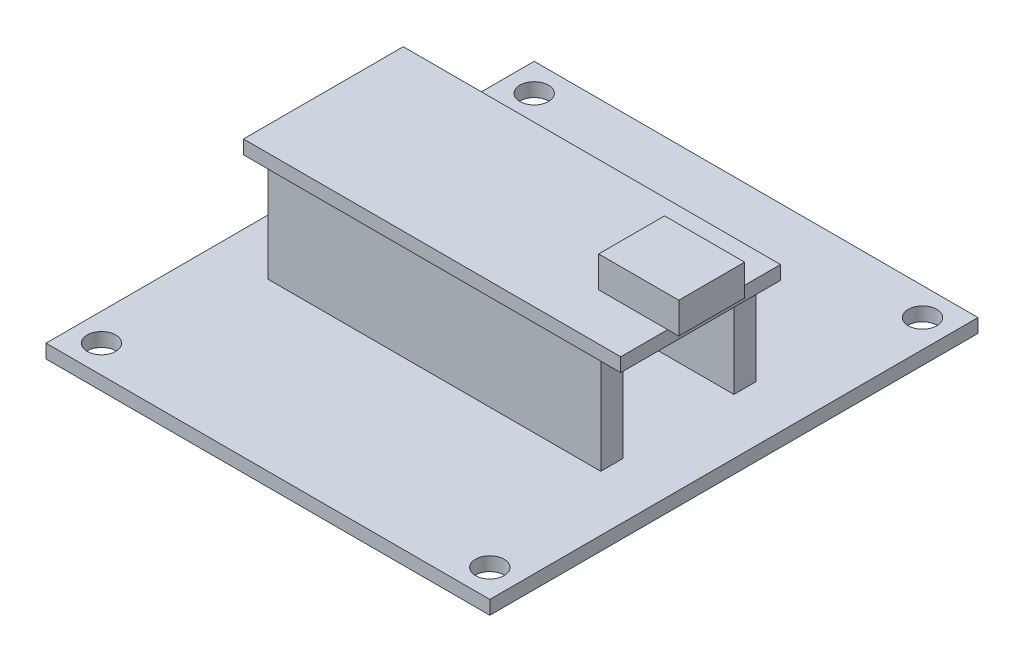
ISO-10303-21;
HEADER;
FILE_DESCRIPTION(('STEP AP214'),'2;1');
FILE_NAME('part.step','',(''),(''),'','','');
FILE_SCHEMA(('AUTOMOTIVE_DESIGN { 1 0 10303 214 1 1 1 1 }'));
ENDSEC;
DATA;
#1=APPLICATION_CONTEXT('core data for automotive mechanical design processes');
#2=APPLICATION_PROTOCOL_DEFINITION('international standard','automotive_design',2000,#1);
#3=PRODUCT_CONTEXT('',#1,'mechanical');
#4=PRODUCT('Part','Part','',(#3));
#5=PRODUCT_RELATED_PRODUCT_CATEGORY('part','',(#4));
#6=PRODUCT_DEFINITION_FORMATION('','',#4);
#7=PRODUCT_DEFINITION_CONTEXT('part definition',#1,'design');
#8=PRODUCT_DEFINITION('design','',#6,#7);
#9=PRODUCT_DEFINITION_SHAPE('','',#8);
#10=(LENGTH_UNIT() NAMED_UNIT(*) SI_UNIT(.MILLI.,.METRE.));
#11=(NAMED_UNIT(*) PLANE_ANGLE_UNIT() SI_UNIT($,.RADIAN.));
#12=(NAMED_UNIT(*) SI_UNIT($,.STERADIAN.) SOLID_ANGLE_UNIT());
#13=UNCERTAINTY_MEASURE_WITH_UNIT(LENGTH_MEASURE(1.E-05),#10,'distance_accuracy_value','');
#14=(GEOMETRIC_REPRESENTATION_CONTEXT(3) GLOBAL_UNCERTAINTY_ASSIGNED_CONTEXT((#13)) GLOBAL_UNIT_ASSIGNED_CONTEXT((#10,
#11,#12)) REPRESENTATION_CONTEXT('',''));
#15=CARTESIAN_POINT('',(0.,0.,0.));
#16=DIRECTION('',(0.,0.,1.));
#17=DIRECTION('',(1.,0.,0.));
#18=AXIS2_PLACEMENT_3D('',#15,#16,#17);
#19=CARTESIAN_POINT('',(21.59,14.3256,-9.144));
#20=DIRECTION('',(0.,-1.,0.));
#21=DIRECTION('',(0.,0.,-1.));
#22=AXIS2_PLACEMENT_3D('',#19,#20,#21);
#23=PLANE('',#22);
#24=DIRECTION('',(1.,0.,0.));
#25=VECTOR('',#24,1.);
#26=CARTESIAN_POINT('',(13.6906,14.3256,3.7719));
#27=LINE('',#26,#25);
#28=CARTESIAN_POINT('',(13.6906,14.3256,3.7719));
#29=VERTEX_POINT('',#28);
#30=CARTESIAN_POINT('',(21.59,14.3256,3.7719));
#31=VERTEX_POINT('',#30);
#32=EDGE_CURVE('E51',#29,#31,#27,.T.);
#33=ORIENTED_EDGE('',*,*,#32,.F.);
#34=DIRECTION('',(0.,0.,1.));
#35=VECTOR('',#34,1.);
#36=CARTESIAN_POINT('',(13.6906,14.3256,3.7719));
#37=LINE('',#36,#35);
#38=CARTESIAN_POINT('',(13.6906,14.3256,-3.7719));
#39=VERTEX_POINT('',#38);
#40=EDGE_CURVE('E693',#39,#29,#37,.T.);
#41=ORIENTED_EDGE('',*,*,#40,.F.);
#42=DIRECTION('',(-1.,0.,0.));
#43=VECTOR('',#42,1.);
#44=CARTESIAN_POINT('',(13.6906,14.3256,-3.7719));
#45=LINE('',#44,#43);
#46=CARTESIAN_POINT('',(21.59,14.3256,-3.7719));
#47=VERTEX_POINT('',#46);
#48=EDGE_CURVE('E11',#47,#39,#45,.T.);
#49=ORIENTED_EDGE('',*,*,#48,.F.);
#50=DIRECTION('',(0.,0.,-1.));
#51=VECTOR('',#50,1.);
#52=CARTESIAN_POINT('',(21.59,14.3256,9.144));
#53=LINE('',#52,#51);
#54=CARTESIAN_POINT('',(21.59,14.3256,-9.144));
#55=VERTEX_POINT('',#54);
#56=EDGE_CURVE('E215',#47,#55,#53,.T.);
#57=ORIENTED_EDGE('',*,*,#56,.T.);
#58=DIRECTION('',(-1.,0.,0.));
#59=VECTOR('',#58,1.);
#60=CARTESIAN_POINT('',(-21.59,14.3256,-9.144));
#61=LINE('',#60,#59);
#62=CARTESIAN_POINT('',(-21.59,14.3256,-9.144));
#63=VERTEX_POINT('',#62);
#64=EDGE_CURVE('E213',#55,#63,#61,.T.);
#65=ORIENTED_EDGE('',*,*,#64,.T.);
#66=DIRECTION('',(0.,0.,1.));
#67=VECTOR('',#66,1.);
#68=CARTESIAN_POINT('',(-21.59,14.3256,9.144));
#69=LINE('',#68,#67);
#70=CARTESIAN_POINT('',(-21.59,14.3256,9.144));
#71=VERTEX_POINT('',#70);
#72=EDGE_CURVE('E217',#63,#71,#69,.T.);
#73=ORIENTED_EDGE('',*,*,#72,.T.);
#74=DIRECTION('',(1.,0.,0.));
#75=VECTOR('',#74,1.);
#76=CARTESIAN_POINT('',(-21.59,14.3256,9.144));
#77=LINE('',#76,#75);
#78=CARTESIAN_POINT('',(21.59,14.3256,9.144));
#79=VERTEX_POINT('',#78);
#80=EDGE_CURVE('E219',#71,#79,#77,.T.);
#81=ORIENTED_EDGE('',*,*,#80,.T.);
#82=EDGE_CURVE('E211',#79,#31,#53,.T.);
#83=ORIENTED_EDGE('',*,*,#82,.T.);
#84=EDGE_LOOP('',(#33,#41,#49,#57,#65,#73,#81,#83));
#85=FACE_BOUND('',#84,.T.);
#86=ADVANCED_FACE('F33',(#85),#23,.F.);
#87=CARTESIAN_POINT('',(25.4,1.5748,-27.94));
#88=DIRECTION('',(0.,-1.,0.));
#89=DIRECTION('',(0.,0.,-1.));
#90=AXIS2_PLACEMENT_3D('',#87,#88,#89);
#91=PLANE('',#90);
#92=DIRECTION('',(0.,0.,1.));
#93=VECTOR('',#92,1.);
#94=CARTESIAN_POINT('',(-19.05,1.5748,6.35));
#95=LINE('',#94,#93);
#96=CARTESIAN_POINT('',(-19.05,1.5748,6.35));
#97=VERTEX_POINT('',#96);
#98=CARTESIAN_POINT('',(-19.05,1.5748,8.89));
#99=VERTEX_POINT('',#98);
#100=EDGE_CURVE('E274',#97,#99,#95,.T.);
#101=ORIENTED_EDGE('',*,*,#100,.F.);
#102=DIRECTION('',(-1.,0.,0.));
#103=VECTOR('',#102,1.);
#104=CARTESIAN_POINT('',(-19.05,1.5748,6.35));
#105=LINE('',#104,#103);
#106=CARTESIAN_POINT('',(19.05,1.5748,6.35));
#107=VERTEX_POINT('',#106);
#108=EDGE_CURVE('E279',#107,#97,#105,.T.);
#109=ORIENTED_EDGE('',*,*,#108,.F.);
#110=DIRECTION('',(0.,0.,-1.));
#111=VECTOR('',#110,1.);
#112=CARTESIAN_POINT('',(19.05,1.5748,6.35));
#113=LINE('',#112,#111);
#114=CARTESIAN_POINT('',(19.05,1.5748,8.89));
#115=VERTEX_POINT('',#114);
#116=EDGE_CURVE('E294',#115,#107,#113,.T.);
#117=ORIENTED_EDGE('',*,*,#116,.F.);
#118=DIRECTION('',(1.,0.,0.));
#119=VECTOR('',#118,1.);
#120=CARTESIAN_POINT('',(-19.05,1.5748,8.89));
#121=LINE('',#120,#119);
#122=EDGE_CURVE('E291',#99,#115,#121,.T.);
#123=ORIENTED_EDGE('',*,*,#122,.F.);
#124=EDGE_LOOP('',(#101,#109,#117,#123));
#125=FACE_BOUND('',#124,.T.);
#126=CARTESIAN_POINT('',(-22.225,1.5748,24.765));
#127=DIRECTION('',(0.,1.,0.));
#128=DIRECTION('',(0.,0.,1.));
#129=AXIS2_PLACEMENT_3D('',#126,#127,#128);
#130=CIRCLE('',#129,1.63194999999999);
#131=CARTESIAN_POINT('',(-22.225,1.5748,26.39695));
#132=VERTEX_POINT('',#131);
#133=EDGE_CURVE('E310',#132,#132,#130,.T.);
#134=ORIENTED_EDGE('',*,*,#133,.F.);
#135=EDGE_LOOP('',(#134));
#136=FACE_BOUND('',#135,.T.);
#137=CARTESIAN_POINT('',(-22.225,1.5748,-24.765));
#138=DIRECTION('',(0.,1.,0.));
#139=DIRECTION('',(0.,0.,1.));
#140=AXIS2_PLACEMENT_3D('',#137,#138,#139);
#141=CIRCLE('',#140,1.63194999999999);
#142=CARTESIAN_POINT('',(-22.225,1.5748,-23.13305));
#143=VERTEX_POINT('',#142);
#144=EDGE_CURVE('E313',#143,#143,#141,.T.);
#145=ORIENTED_EDGE('',*,*,#144,.F.);
#146=EDGE_LOOP('',(#145));
#147=FACE_BOUND('',#146,.T.);
#148=CARTESIAN_POINT('',(22.225,1.5748,-24.765));
#149=DIRECTION('',(0.,1.,0.));
#150=DIRECTION('',(0.,0.,1.));
#151=AXIS2_PLACEMENT_3D('',#148,#149,#150);
#152=CIRCLE('',#151,1.63194999999999);
#153=CARTESIAN_POINT('',(22.225,1.5748,-23.13305));
#154=VERTEX_POINT('',#153);
#155=EDGE_CURVE('E317',#154,#154,#152,.T.);
#156=ORIENTED_EDGE('',*,*,#155,.F.);
#157=EDGE_LOOP('',(#156));
#158=FACE_BOUND('',#157,.T.);
#159=CARTESIAN_POINT('',(22.225,1.5748,24.765));
#160=DIRECTION('',(0.,1.,0.));
#161=DIRECTION('',(0.,0.,1.));
#162=AXIS2_PLACEMENT_3D('',#159,#160,#161);
#163=CIRCLE('',#162,1.63194999999999);
#164=CARTESIAN_POINT('',(22.225,1.5748,26.39695));
#165=VERTEX_POINT('',#164);
#166=EDGE_CURVE('E321',#165,#165,#163,.T.);
#167=ORIENTED_EDGE('',*,*,#166,.F.);
#168=EDGE_LOOP('',(#167));
#169=FACE_BOUND('',#168,.T.);
#170=DIRECTION('',(0.,0.,-1.));
#171=VECTOR('',#170,1.);
#172=CARTESIAN_POINT('',(25.4,1.5748,27.94));
#173=LINE('',#172,#171);
#174=CARTESIAN_POINT('',(25.4,1.5748,27.94));
#175=VERTEX_POINT('',#174);
#176=CARTESIAN_POINT('',(25.4,1.5748,-27.94));
#177=VERTEX_POINT('',#176);
#178=EDGE_CURVE('E328',#175,#177,#173,.T.);
#179=ORIENTED_EDGE('',*,*,#178,.T.);
#180=DIRECTION('',(-1.,0.,0.));
#181=VECTOR('',#180,1.);
#182=CARTESIAN_POINT('',(-25.4,1.5748,-27.94));
#183=LINE('',#182,#181);
#184=CARTESIAN_POINT('',(-25.4,1.5748,-27.94));
#185=VERTEX_POINT('',#184);
#186=EDGE_CURVE('E331',#177,#185,#183,.T.);
#187=ORIENTED_EDGE('',*,*,#186,.T.);
#188=DIRECTION('',(0.,0.,1.));
#189=VECTOR('',#188,1.);
#190=CARTESIAN_POINT('',(-25.4,1.5748,27.94));
#191=LINE('',#190,#189);
#192=CARTESIAN_POINT('',(-25.4,1.5748,27.94));
#193=VERTEX_POINT('',#192);
#194=EDGE_CURVE('E334',#185,#193,#191,.T.);
#195=ORIENTED_EDGE('',*,*,#194,.T.);
#196=DIRECTION('',(1.,0.,0.));
#197=VECTOR('',#196,1.);
#198=CARTESIAN_POINT('',(-25.4,1.5748,27.94));
#199=LINE('',#198,#197);
#200=EDGE_CURVE('E336',#193,#175,#199,.T.);
#201=ORIENTED_EDGE('',*,*,#200,.T.);
#202=EDGE_LOOP('',(#179,#187,#195,#201));
#203=FACE_BOUND('',#202,.T.);
#204=DIRECTION('',(0.,0.,1.));
#205=VECTOR('',#204,1.);
#206=CARTESIAN_POINT('',(-19.05,1.5748,-8.89));
#207=LINE('',#206,#205);
#208=CARTESIAN_POINT('',(-19.05,1.5748,-8.89));
#209=VERTEX_POINT('',#208);
#210=CARTESIAN_POINT('',(-19.05,1.5748,-6.35));
#211=VERTEX_POINT('',#210);
#212=EDGE_CURVE('E238',#209,#211,#207,.T.);
#213=ORIENTED_EDGE('',*,*,#212,.F.);
#214=DIRECTION('',(-1.,0.,0.));
#215=VECTOR('',#214,1.);
#216=CARTESIAN_POINT('',(-19.05,1.5748,-8.89));
#217=LINE('',#216,#215);
#218=CARTESIAN_POINT('',(19.05,1.5748,-8.89));
#219=VERTEX_POINT('',#218);
#220=EDGE_CURVE('E243',#219,#209,#217,.T.);
#221=ORIENTED_EDGE('',*,*,#220,.F.);
#222=DIRECTION('',(0.,0.,-1.));
#223=VECTOR('',#222,1.);
#224=CARTESIAN_POINT('',(19.05,1.5748,-8.89));
#225=LINE('',#224,#223);
#226=CARTESIAN_POINT('',(19.05,1.5748,-6.35));
#227=VERTEX_POINT('',#226);
#228=EDGE_CURVE('E258',#227,#219,#225,.T.);
#229=ORIENTED_EDGE('',*,*,#228,.F.);
#230=DIRECTION('',(1.,0.,0.));
#231=VECTOR('',#230,1.);
#232=CARTESIAN_POINT('',(-19.05,1.5748,-6.35));
#233=LINE('',#232,#231);
#234=EDGE_CURVE('E255',#211,#227,#233,.T.);
#235=ORIENTED_EDGE('',*,*,#234,.F.);
#236=EDGE_LOOP('',(#213,#221,#229,#235));
#237=FACE_BOUND('',#236,.T.);
#238=ADVANCED_FACE('F391',(#125,#136,#147,#158,#169,#203,#237),#91,.F.);
#239=CARTESIAN_POINT('',(25.4,1.5748,27.94));
#240=DIRECTION('',(-1.,0.,0.));
#241=DIRECTION('',(0.,0.,1.));
#242=AXIS2_PLACEMENT_3D('',#239,#240,#241);
#243=PLANE('',#242);
#244=DIRECTION('',(0.,0.,-1.));
#245=VECTOR('',#244,1.);
#246=CARTESIAN_POINT('',(25.4,0.,27.94));
#247=LINE('',#246,#245);
#248=CARTESIAN_POINT('',(25.4,0.,27.94));
#249=VERTEX_POINT('',#248);
#250=CARTESIAN_POINT('',(25.4,0.,-27.94));
#251=VERTEX_POINT('',#250);
#252=EDGE_CURVE('E327',#249,#251,#247,.T.);
#253=ORIENTED_EDGE('',*,*,#252,.T.);
#254=DIRECTION('',(0.,-1.,0.));
#255=VECTOR('',#254,1.);
#256=CARTESIAN_POINT('',(25.4,1.5748,-27.94));
#257=LINE('',#256,#255);
#258=EDGE_CURVE('E42',#177,#251,#257,.T.);
#259=ORIENTED_EDGE('',*,*,#258,.F.);
#260=ORIENTED_EDGE('',*,*,#178,.F.);
#261=DIRECTION('',(0.,-1.,0.));
#262=VECTOR('',#261,1.);
#263=CARTESIAN_POINT('',(25.4,1.5748,27.94));
#264=LINE('',#263,#262);
#265=EDGE_CURVE('E338',#175,#249,#264,.T.);
#266=ORIENTED_EDGE('',*,*,#265,.T.);
#267=EDGE_LOOP('',(#253,#259,#260,#266));
#268=FACE_BOUND('',#267,.T.);
#269=ADVANCED_FACE('F35',(#268),#243,.F.);
#270=CARTESIAN_POINT('',(-25.4,1.5748,-27.94));
#271=DIRECTION('',(0.,0.,1.));
#272=DIRECTION('',(1.,0.,0.));
#273=AXIS2_PLACEMENT_3D('',#270,#271,#272);
#274=PLANE('',#273);
#275=DIRECTION('',(-1.,0.,0.));
#276=VECTOR('',#275,1.);
#277=CARTESIAN_POINT('',(-25.4,0.,-27.94));
#278=LINE('',#277,#276);
#279=CARTESIAN_POINT('',(-25.4,0.,-27.94));
#280=VERTEX_POINT('',#279);
#281=EDGE_CURVE('E341',#251,#280,#278,.T.);
#282=ORIENTED_EDGE('',*,*,#281,.T.);
#283=DIRECTION('',(0.,-1.,0.));
#284=VECTOR('',#283,1.);
#285=CARTESIAN_POINT('',(-25.4,1.5748,-27.94));
#286=LINE('',#285,#284);
#287=EDGE_CURVE('E351',#185,#280,#286,.T.);
#288=ORIENTED_EDGE('',*,*,#287,.F.);
#289=ORIENTED_EDGE('',*,*,#186,.F.);
#290=ORIENTED_EDGE('',*,*,#258,.T.);
#291=EDGE_LOOP('',(#282,#288,#289,#290));
#292=FACE_BOUND('',#291,.T.);
#293=ADVANCED_FACE('F389',(#292),#274,.F.);
#294=CARTESIAN_POINT('',(-25.4,1.5748,27.94));
#295=DIRECTION('',(1.,0.,0.));
#296=DIRECTION('',(0.,0.,-1.));
#297=AXIS2_PLACEMENT_3D('',#294,#295,#296);
#298=PLANE('',#297);
#299=DIRECTION('',(0.,0.,1.));
#300=VECTOR('',#299,1.);
#301=CARTESIAN_POINT('',(-25.4,0.,27.94));
#302=LINE('',#301,#300);
#303=CARTESIAN_POINT('',(-25.4,0.,27.94));
#304=VERTEX_POINT('',#303);
#305=EDGE_CURVE('E343',#280,#304,#302,.T.);
#306=ORIENTED_EDGE('',*,*,#305,.T.);
#307=DIRECTION('',(0.,-1.,0.));
#308=VECTOR('',#307,1.);
#309=CARTESIAN_POINT('',(-25.4,1.5748,27.94));
#310=LINE('',#309,#308);
#311=EDGE_CURVE('E348',#193,#304,#310,.T.);
#312=ORIENTED_EDGE('',*,*,#311,.F.);
#313=ORIENTED_EDGE('',*,*,#194,.F.);
#314=ORIENTED_EDGE('',*,*,#287,.T.);
#315=EDGE_LOOP('',(#306,#312,#313,#314));
#316=FACE_BOUND('',#315,.T.);
#317=ADVANCED_FACE('F386',(#316),#298,.F.);
#318=CARTESIAN_POINT('',(-25.4,1.5748,27.94));
#319=DIRECTION('',(0.,0.,-1.));
#320=DIRECTION('',(-1.,0.,0.));
#321=AXIS2_PLACEMENT_3D('',#318,#319,#320);
#322=PLANE('',#321);
#323=DIRECTION('',(1.,0.,0.));
#324=VECTOR('',#323,1.);
#325=CARTESIAN_POINT('',(-25.4,0.,27.94));
#326=LINE('',#325,#324);
#327=EDGE_CURVE('E332',#304,#249,#326,.T.);
#328=ORIENTED_EDGE('',*,*,#327,.T.);
#329=ORIENTED_EDGE('',*,*,#265,.F.);
#330=ORIENTED_EDGE('',*,*,#200,.F.);
#331=ORIENTED_EDGE('',*,*,#311,.T.);
#332=EDGE_LOOP('',(#328,#329,#330,#331));
#333=FACE_BOUND('',#332,.T.);
#334=ADVANCED_FACE('F367',(#333),#322,.F.);
#335=CARTESIAN_POINT('',(25.4,0.,-27.94));
#336=DIRECTION('',(0.,-1.,0.));
#337=DIRECTION('',(0.,0.,-1.));
#338=AXIS2_PLACEMENT_3D('',#335,#336,#337);
#339=PLANE('',#338);
#340=CARTESIAN_POINT('',(-22.225,0.,24.765));
#341=DIRECTION('',(0.,-1.,0.));
#342=DIRECTION('',(0.,0.,-1.));
#343=AXIS2_PLACEMENT_3D('',#340,#341,#342);
#344=CIRCLE('',#343,1.63194999999999);
#345=CARTESIAN_POINT('',(-22.225,0.,23.13305));
#346=VERTEX_POINT('',#345);
#347=EDGE_CURVE('E37',#346,#346,#344,.T.);
#348=ORIENTED_EDGE('',*,*,#347,.F.);
#349=EDGE_LOOP('',(#348));
#350=FACE_BOUND('',#349,.T.);
#351=CARTESIAN_POINT('',(-22.225,0.,-24.765));
#352=DIRECTION('',(0.,-1.,0.));
#353=DIRECTION('',(0.,0.,-1.));
#354=AXIS2_PLACEMENT_3D('',#351,#352,#353);
#355=CIRCLE('',#354,1.63194999999999);
#356=CARTESIAN_POINT('',(-22.225,0.,-26.39695));
#357=VERTEX_POINT('',#356);
#358=EDGE_CURVE('E316',#357,#357,#355,.T.);
#359=ORIENTED_EDGE('',*,*,#358,.F.);
#360=EDGE_LOOP('',(#359));
#361=FACE_BOUND('',#360,.T.);
#362=CARTESIAN_POINT('',(22.225,0.,-24.765));
#363=DIRECTION('',(0.,-1.,0.));
#364=DIRECTION('',(0.,0.,-1.));
#365=AXIS2_PLACEMENT_3D('',#362,#363,#364);
#366=CIRCLE('',#365,1.63194999999999);
#367=CARTESIAN_POINT('',(22.225,0.,-26.39695));
#368=VERTEX_POINT('',#367);
#369=EDGE_CURVE('E320',#368,#368,#366,.T.);
#370=ORIENTED_EDGE('',*,*,#369,.F.);
#371=EDGE_LOOP('',(#370));
#372=FACE_BOUND('',#371,.T.);
#373=CARTESIAN_POINT('',(22.225,0.,24.765));
#374=DIRECTION('',(0.,-1.,0.));
#375=DIRECTION('',(0.,0.,-1.));
#376=AXIS2_PLACEMENT_3D('',#373,#374,#375);
#377=CIRCLE('',#376,1.63194999999999);
#378=CARTESIAN_POINT('',(22.225,0.,23.13305));
#379=VERTEX_POINT('',#378);
#380=EDGE_CURVE('E324',#379,#379,#377,.T.);
#381=ORIENTED_EDGE('',*,*,#380,.F.);
#382=EDGE_LOOP('',(#381));
#383=FACE_BOUND('',#382,.T.);
#384=ORIENTED_EDGE('',*,*,#252,.F.);
#385=ORIENTED_EDGE('',*,*,#327,.F.);
#386=ORIENTED_EDGE('',*,*,#305,.F.);
#387=ORIENTED_EDGE('',*,*,#281,.F.);
#388=EDGE_LOOP('',(#384,#385,#386,#387));
#389=FACE_BOUND('',#388,.T.);
#390=ADVANCED_FACE('F363',(#350,#361,#372,#383,#389),#339,.T.);
#391=CARTESIAN_POINT('',(22.225,1.5748,24.765));
#392=DIRECTION('',(0.,1.,0.));
#393=DIRECTION('',(0.,0.,1.));
#394=AXIS2_PLACEMENT_3D('',#391,#392,#393);
#395=CYLINDRICAL_SURFACE('',#394,1.63194999999999);
#396=ORIENTED_EDGE('',*,*,#380,.T.);
#397=EDGE_LOOP('',(#396));
#398=FACE_BOUND('',#397,.T.);
#399=ORIENTED_EDGE('',*,*,#166,.T.);
#400=EDGE_LOOP('',(#399));
#401=FACE_BOUND('',#400,.T.);
#402=ADVANCED_FACE('F366',(#398,#401),#395,.F.);
#403=CARTESIAN_POINT('',(22.225,1.5748,-24.765));
#404=DIRECTION('',(0.,1.,0.));
#405=DIRECTION('',(0.,0.,1.));
#406=AXIS2_PLACEMENT_3D('',#403,#404,#405);
#407=CYLINDRICAL_SURFACE('',#406,1.63194999999999);
#408=ORIENTED_EDGE('',*,*,#369,.T.);
#409=EDGE_LOOP('',(#408));
#410=FACE_BOUND('',#409,.T.);
#411=ORIENTED_EDGE('',*,*,#155,.T.);
#412=EDGE_LOOP('',(#411));
#413=FACE_BOUND('',#412,.T.);
#414=ADVANCED_FACE('F608',(#410,#413),#407,.F.);
#415=CARTESIAN_POINT('',(-22.225,1.5748,-24.765));
#416=DIRECTION('',(0.,1.,0.));
#417=DIRECTION('',(0.,0.,1.));
#418=AXIS2_PLACEMENT_3D('',#415,#416,#417);
#419=CYLINDRICAL_SURFACE('',#418,1.63194999999999);
#420=ORIENTED_EDGE('',*,*,#358,.T.);
#421=EDGE_LOOP('',(#420));
#422=FACE_BOUND('',#421,.T.);
#423=ORIENTED_EDGE('',*,*,#144,.T.);
#424=EDGE_LOOP('',(#423));
#425=FACE_BOUND('',#424,.T.);
#426=ADVANCED_FACE('F360',(#422,#425),#419,.F.);
#427=CARTESIAN_POINT('',(-22.225,1.5748,24.765));
#428=DIRECTION('',(0.,1.,0.));
#429=DIRECTION('',(0.,0.,1.));
#430=AXIS2_PLACEMENT_3D('',#427,#428,#429);
#431=CYLINDRICAL_SURFACE('',#430,1.63194999999999);
#432=ORIENTED_EDGE('',*,*,#347,.T.);
#433=EDGE_LOOP('',(#432));
#434=FACE_BOUND('',#433,.T.);
#435=ORIENTED_EDGE('',*,*,#133,.T.);
#436=EDGE_LOOP('',(#435));
#437=FACE_BOUND('',#436,.T.);
#438=ADVANCED_FACE('F586',(#434,#437),#431,.F.);
#439=CARTESIAN_POINT('',(-19.05,12.7508,6.35));
#440=DIRECTION('',(1.,0.,0.));
#441=DIRECTION('',(0.,0.,-1.));
#442=AXIS2_PLACEMENT_3D('',#439,#440,#441);
#443=PLANE('',#442);
#444=ORIENTED_EDGE('',*,*,#100,.T.);
#445=DIRECTION('',(0.,-1.,0.));
#446=VECTOR('',#445,1.);
#447=CARTESIAN_POINT('',(-19.05,12.7508,8.89));
#448=LINE('',#447,#446);
#449=CARTESIAN_POINT('',(-19.05,12.7508,8.89));
#450=VERTEX_POINT('',#449);
#451=EDGE_CURVE('E307',#450,#99,#448,.T.);
#452=ORIENTED_EDGE('',*,*,#451,.F.);
#453=DIRECTION('',(0.,0.,1.));
#454=VECTOR('',#453,1.);
#455=CARTESIAN_POINT('',(-19.05,12.7508,6.35));
#456=LINE('',#455,#454);
#457=CARTESIAN_POINT('',(-19.05,12.7508,6.35));
#458=VERTEX_POINT('',#457);
#459=EDGE_CURVE('E275',#458,#450,#456,.T.);
#460=ORIENTED_EDGE('',*,*,#459,.F.);
#461=DIRECTION('',(0.,-1.,0.));
#462=VECTOR('',#461,1.);
#463=CARTESIAN_POINT('',(-19.05,12.7508,6.35));
#464=LINE('',#463,#462);
#465=EDGE_CURVE('E288',#458,#97,#464,.T.);
#466=ORIENTED_EDGE('',*,*,#465,.T.);
#467=EDGE_LOOP('',(#444,#452,#460,#466));
#468=FACE_BOUND('',#467,.T.);
#469=ADVANCED_FACE('F577',(#468),#443,.F.);
#470=CARTESIAN_POINT('',(-19.05,12.7508,8.89));
#471=DIRECTION('',(0.,0.,-1.));
#472=DIRECTION('',(-1.,0.,0.));
#473=AXIS2_PLACEMENT_3D('',#470,#471,#472);
#474=PLANE('',#473);
#475=ORIENTED_EDGE('',*,*,#122,.T.);
#476=DIRECTION('',(0.,-1.,0.));
#477=VECTOR('',#476,1.);
#478=CARTESIAN_POINT('',(19.05,12.7508,8.89));
#479=LINE('',#478,#477);
#480=CARTESIAN_POINT('',(19.05,12.7508,8.89));
#481=VERTEX_POINT('',#480);
#482=EDGE_CURVE('E304',#481,#115,#479,.T.);
#483=ORIENTED_EDGE('',*,*,#482,.F.);
#484=DIRECTION('',(1.,0.,0.));
#485=VECTOR('',#484,1.);
#486=CARTESIAN_POINT('',(-19.05,12.7508,8.89));
#487=LINE('',#486,#485);
#488=EDGE_CURVE('E278',#450,#481,#487,.T.);
#489=ORIENTED_EDGE('',*,*,#488,.F.);
#490=ORIENTED_EDGE('',*,*,#451,.T.);
#491=EDGE_LOOP('',(#475,#483,#489,#490));
#492=FACE_BOUND('',#491,.T.);
#493=ADVANCED_FACE('F568',(#492),#474,.F.);
#494=CARTESIAN_POINT('',(19.05,12.7508,6.35));
#495=DIRECTION('',(-1.,0.,0.));
#496=DIRECTION('',(0.,0.,1.));
#497=AXIS2_PLACEMENT_3D('',#494,#495,#496);
#498=PLANE('',#497);
#499=ORIENTED_EDGE('',*,*,#116,.T.);
#500=DIRECTION('',(0.,-1.,0.));
#501=VECTOR('',#500,1.);
#502=CARTESIAN_POINT('',(19.05,12.7508,6.35));
#503=LINE('',#502,#501);
#504=CARTESIAN_POINT('',(19.05,12.7508,6.35));
#505=VERTEX_POINT('',#504);
#506=EDGE_CURVE('E301',#505,#107,#503,.T.);
#507=ORIENTED_EDGE('',*,*,#506,.F.);
#508=DIRECTION('',(0.,0.,-1.));
#509=VECTOR('',#508,1.);
#510=CARTESIAN_POINT('',(19.05,12.7508,6.35));
#511=LINE('',#510,#509);
#512=EDGE_CURVE('E282',#481,#505,#511,.T.);
#513=ORIENTED_EDGE('',*,*,#512,.F.);
#514=ORIENTED_EDGE('',*,*,#482,.T.);
#515=EDGE_LOOP('',(#499,#507,#513,#514));
#516=FACE_BOUND('',#515,.T.);
#517=ADVANCED_FACE('F559',(#516),#498,.F.);
#518=CARTESIAN_POINT('',(-19.05,12.7508,6.35));
#519=DIRECTION('',(0.,0.,1.));
#520=DIRECTION('',(1.,0.,0.));
#521=AXIS2_PLACEMENT_3D('',#518,#519,#520);
#522=PLANE('',#521);
#523=ORIENTED_EDGE('',*,*,#108,.T.);
#524=ORIENTED_EDGE('',*,*,#465,.F.);
#525=DIRECTION('',(-1.,0.,0.));
#526=VECTOR('',#525,1.);
#527=CARTESIAN_POINT('',(-19.05,12.7508,6.35));
#528=LINE('',#527,#526);
#529=EDGE_CURVE('E285',#505,#458,#528,.T.);
#530=ORIENTED_EDGE('',*,*,#529,.F.);
#531=ORIENTED_EDGE('',*,*,#506,.T.);
#532=EDGE_LOOP('',(#523,#524,#530,#531));
#533=FACE_BOUND('',#532,.T.);
#534=ADVANCED_FACE('F418',(#533),#522,.F.);
#535=CARTESIAN_POINT('',(-19.05,12.7508,-8.89));
#536=DIRECTION('',(1.,0.,0.));
#537=DIRECTION('',(0.,0.,-1.));
#538=AXIS2_PLACEMENT_3D('',#535,#536,#537);
#539=PLANE('',#538);
#540=ORIENTED_EDGE('',*,*,#212,.T.);
#541=DIRECTION('',(0.,-1.,0.));
#542=VECTOR('',#541,1.);
#543=CARTESIAN_POINT('',(-19.05,12.7508,-6.35));
#544=LINE('',#543,#542);
#545=CARTESIAN_POINT('',(-19.05,12.7508,-6.35));
#546=VERTEX_POINT('',#545);
#547=EDGE_CURVE('E271',#546,#211,#544,.T.);
#548=ORIENTED_EDGE('',*,*,#547,.F.);
#549=DIRECTION('',(0.,0.,1.));
#550=VECTOR('',#549,1.);
#551=CARTESIAN_POINT('',(-19.05,12.7508,-8.89));
#552=LINE('',#551,#550);
#553=CARTESIAN_POINT('',(-19.05,12.7508,-8.89));
#554=VERTEX_POINT('',#553);
#555=EDGE_CURVE('E239',#554,#546,#552,.T.);
#556=ORIENTED_EDGE('',*,*,#555,.F.);
#557=DIRECTION('',(0.,-1.,0.));
#558=VECTOR('',#557,1.);
#559=CARTESIAN_POINT('',(-19.05,12.7508,-8.89));
#560=LINE('',#559,#558);
#561=EDGE_CURVE('E252',#554,#209,#560,.T.);
#562=ORIENTED_EDGE('',*,*,#561,.T.);
#563=EDGE_LOOP('',(#540,#548,#556,#562));
#564=FACE_BOUND('',#563,.T.);
#565=ADVANCED_FACE('F402',(#564),#539,.F.);
#566=CARTESIAN_POINT('',(-19.05,12.7508,-6.35));
#567=DIRECTION('',(0.,0.,-1.));
#568=DIRECTION('',(-1.,0.,0.));
#569=AXIS2_PLACEMENT_3D('',#566,#567,#568);
#570=PLANE('',#569);
#571=ORIENTED_EDGE('',*,*,#234,.T.);
#572=DIRECTION('',(0.,-1.,0.));
#573=VECTOR('',#572,1.);
#574=CARTESIAN_POINT('',(19.05,12.7508,-6.35));
#575=LINE('',#574,#573);
#576=CARTESIAN_POINT('',(19.05,12.7508,-6.35));
#577=VERTEX_POINT('',#576);
#578=EDGE_CURVE('E268',#577,#227,#575,.T.);
#579=ORIENTED_EDGE('',*,*,#578,.F.);
#580=DIRECTION('',(1.,0.,0.));
#581=VECTOR('',#580,1.);
#582=CARTESIAN_POINT('',(-19.05,12.7508,-6.35));
#583=LINE('',#582,#581);
#584=EDGE_CURVE('E242',#546,#577,#583,.T.);
#585=ORIENTED_EDGE('',*,*,#584,.F.);
#586=ORIENTED_EDGE('',*,*,#547,.T.);
#587=EDGE_LOOP('',(#571,#579,#585,#586));
#588=FACE_BOUND('',#587,.T.);
#589=ADVANCED_FACE('F410',(#588),#570,.F.);
#590=CARTESIAN_POINT('',(19.05,12.7508,-8.89));
#591=DIRECTION('',(-1.,0.,0.));
#592=DIRECTION('',(0.,0.,1.));
#593=AXIS2_PLACEMENT_3D('',#590,#591,#592);
#594=PLANE('',#593);
#595=ORIENTED_EDGE('',*,*,#228,.T.);
#596=DIRECTION('',(0.,-1.,0.));
#597=VECTOR('',#596,1.);
#598=CARTESIAN_POINT('',(19.05,12.7508,-8.89));
#599=LINE('',#598,#597);
#600=CARTESIAN_POINT('',(19.05,12.7508,-8.89));
#601=VERTEX_POINT('',#600);
#602=EDGE_CURVE('E265',#601,#219,#599,.T.);
#603=ORIENTED_EDGE('',*,*,#602,.F.);
#604=DIRECTION('',(0.,0.,-1.));
#605=VECTOR('',#604,1.);
#606=CARTESIAN_POINT('',(19.05,12.7508,-8.89));
#607=LINE('',#606,#605);
#608=EDGE_CURVE('E246',#577,#601,#607,.T.);
#609=ORIENTED_EDGE('',*,*,#608,.F.);
#610=ORIENTED_EDGE('',*,*,#578,.T.);
#611=EDGE_LOOP('',(#595,#603,#609,#610));
#612=FACE_BOUND('',#611,.T.);
#613=ADVANCED_FACE('F408',(#612),#594,.F.);
#614=CARTESIAN_POINT('',(-19.05,12.7508,-8.89));
#615=DIRECTION('',(0.,0.,1.));
#616=DIRECTION('',(1.,0.,0.));
#617=AXIS2_PLACEMENT_3D('',#614,#615,#616);
#618=PLANE('',#617);
#619=ORIENTED_EDGE('',*,*,#220,.T.);
#620=ORIENTED_EDGE('',*,*,#561,.F.);
#621=DIRECTION('',(-1.,0.,0.));
#622=VECTOR('',#621,1.);
#623=CARTESIAN_POINT('',(-19.05,12.7508,-8.89));
#624=LINE('',#623,#622);
#625=EDGE_CURVE('E249',#601,#554,#624,.T.);
#626=ORIENTED_EDGE('',*,*,#625,.F.);
#627=ORIENTED_EDGE('',*,*,#602,.T.);
#628=EDGE_LOOP('',(#619,#620,#626,#627));
#629=FACE_BOUND('',#628,.T.);
#630=ADVANCED_FACE('F400',(#629),#618,.F.);
#631=CARTESIAN_POINT('',(21.59,12.7508,-9.144));
#632=DIRECTION('',(0.,-1.,0.));
#633=DIRECTION('',(0.,0.,-1.));
#634=AXIS2_PLACEMENT_3D('',#631,#632,#633);
#635=PLANE('',#634);
#636=ORIENTED_EDGE('',*,*,#555,.T.);
#637=ORIENTED_EDGE('',*,*,#584,.T.);
#638=ORIENTED_EDGE('',*,*,#608,.T.);
#639=ORIENTED_EDGE('',*,*,#625,.T.);
#640=EDGE_LOOP('',(#636,#637,#638,#639));
#641=FACE_BOUND('',#640,.T.);
#642=DIRECTION('',(0.,0.,-1.));
#643=VECTOR('',#642,1.);
#644=CARTESIAN_POINT('',(21.59,12.7508,9.144));
#645=LINE('',#644,#643);
#646=CARTESIAN_POINT('',(21.59,12.7508,9.144));
#647=VERTEX_POINT('',#646);
#648=CARTESIAN_POINT('',(21.59,12.7508,-9.144));
#649=VERTEX_POINT('',#648);
#650=EDGE_CURVE('E202',#647,#649,#645,.T.);
#651=ORIENTED_EDGE('',*,*,#650,.F.);
#652=DIRECTION('',(1.,0.,0.));
#653=VECTOR('',#652,1.);
#654=CARTESIAN_POINT('',(-21.59,12.7508,9.144));
#655=LINE('',#654,#653);
#656=CARTESIAN_POINT('',(-21.59,12.7508,9.144));
#657=VERTEX_POINT('',#656);
#658=EDGE_CURVE('E225',#657,#647,#655,.T.);
#659=ORIENTED_EDGE('',*,*,#658,.F.);
#660=DIRECTION('',(0.,0.,1.));
#661=VECTOR('',#660,1.);
#662=CARTESIAN_POINT('',(-21.59,12.7508,9.144));
#663=LINE('',#662,#661);
#664=CARTESIAN_POINT('',(-21.59,12.7508,-9.144));
#665=VERTEX_POINT('',#664);
#666=EDGE_CURVE('E223',#665,#657,#663,.T.);
#667=ORIENTED_EDGE('',*,*,#666,.F.);
#668=DIRECTION('',(-1.,0.,0.));
#669=VECTOR('',#668,1.);
#670=CARTESIAN_POINT('',(-21.59,12.7508,-9.144));
#671=LINE('',#670,#669);
#672=EDGE_CURVE('E205',#649,#665,#671,.T.);
#673=ORIENTED_EDGE('',*,*,#672,.F.);
#674=EDGE_LOOP('',(#651,#659,#667,#673));
#675=FACE_BOUND('',#674,.T.);
#676=ORIENTED_EDGE('',*,*,#459,.T.);
#677=ORIENTED_EDGE('',*,*,#488,.T.);
#678=ORIENTED_EDGE('',*,*,#512,.T.);
#679=ORIENTED_EDGE('',*,*,#529,.T.);
#680=EDGE_LOOP('',(#676,#677,#678,#679));
#681=FACE_BOUND('',#680,.T.);
#682=ADVANCED_FACE('F404',(#641,#675,#681),#635,.T.);
#683=CARTESIAN_POINT('',(21.59,14.3256,9.144));
#684=DIRECTION('',(-1.,0.,0.));
#685=DIRECTION('',(0.,0.,1.));
#686=AXIS2_PLACEMENT_3D('',#683,#684,#685);
#687=PLANE('',#686);
#688=ORIENTED_EDGE('',*,*,#650,.T.);
#689=DIRECTION('',(0.,-1.,0.));
#690=VECTOR('',#689,1.);
#691=CARTESIAN_POINT('',(21.59,14.3256,-9.144));
#692=LINE('',#691,#690);
#693=EDGE_CURVE('E235',#55,#649,#692,.T.);
#694=ORIENTED_EDGE('',*,*,#693,.F.);
#695=ORIENTED_EDGE('',*,*,#56,.F.);
#696=EDGE_CURVE('E214',#31,#47,#53,.T.);
#697=ORIENTED_EDGE('',*,*,#696,.F.);
#698=ORIENTED_EDGE('',*,*,#82,.F.);
#699=DIRECTION('',(0.,-1.,0.));
#700=VECTOR('',#699,1.);
#701=CARTESIAN_POINT('',(21.59,14.3256,9.144));
#702=LINE('',#701,#700);
#703=EDGE_CURVE('E220',#79,#647,#702,.T.);
#704=ORIENTED_EDGE('',*,*,#703,.T.);
#705=EDGE_LOOP('',(#688,#694,#695,#697,#698,#704));
#706=FACE_BOUND('',#705,.T.);
#707=ADVANCED_FACE('F429',(#706),#687,.F.);
#708=CARTESIAN_POINT('',(-21.59,14.3256,-9.144));
#709=DIRECTION('',(0.,0.,1.));
#710=DIRECTION('',(1.,0.,0.));
#711=AXIS2_PLACEMENT_3D('',#708,#709,#710);
#712=PLANE('',#711);
#713=ORIENTED_EDGE('',*,*,#672,.T.);
#714=DIRECTION('',(0.,-1.,0.));
#715=VECTOR('',#714,1.);
#716=CARTESIAN_POINT('',(-21.59,14.3256,-9.144));
#717=LINE('',#716,#715);
#718=EDGE_CURVE('E232',#63,#665,#717,.T.);
#719=ORIENTED_EDGE('',*,*,#718,.F.);
#720=ORIENTED_EDGE('',*,*,#64,.F.);
#721=ORIENTED_EDGE('',*,*,#693,.T.);
#722=EDGE_LOOP('',(#713,#719,#720,#721));
#723=FACE_BOUND('',#722,.T.);
#724=ADVANCED_FACE('F437',(#723),#712,.F.);
#725=CARTESIAN_POINT('',(-21.59,14.3256,9.144));
#726=DIRECTION('',(1.,0.,0.));
#727=DIRECTION('',(0.,0.,-1.));
#728=AXIS2_PLACEMENT_3D('',#725,#726,#727);
#729=PLANE('',#728);
#730=ORIENTED_EDGE('',*,*,#666,.T.);
#731=DIRECTION('',(0.,-1.,0.));
#732=VECTOR('',#731,1.);
#733=CARTESIAN_POINT('',(-21.59,14.3256,9.144));
#734=LINE('',#733,#732);
#735=EDGE_CURVE('E229',#71,#657,#734,.T.);
#736=ORIENTED_EDGE('',*,*,#735,.F.);
#737=ORIENTED_EDGE('',*,*,#72,.F.);
#738=ORIENTED_EDGE('',*,*,#718,.T.);
#739=EDGE_LOOP('',(#730,#736,#737,#738));
#740=FACE_BOUND('',#739,.T.);
#741=ADVANCED_FACE('F433',(#740),#729,.F.);
#742=CARTESIAN_POINT('',(-21.59,14.3256,9.144));
#743=DIRECTION('',(0.,0.,-1.));
#744=DIRECTION('',(-1.,0.,0.));
#745=AXIS2_PLACEMENT_3D('',#742,#743,#744);
#746=PLANE('',#745);
#747=ORIENTED_EDGE('',*,*,#658,.T.);
#748=ORIENTED_EDGE('',*,*,#703,.F.);
#749=ORIENTED_EDGE('',*,*,#80,.F.);
#750=ORIENTED_EDGE('',*,*,#735,.T.);
#751=EDGE_LOOP('',(#747,#748,#749,#750));
#752=FACE_BOUND('',#751,.T.);
#753=ADVANCED_FACE('F430',(#752),#746,.F.);
#754=CARTESIAN_POINT('',(22.86,17.8816,3.7719));
#755=DIRECTION('',(-1.,0.,0.));
#756=DIRECTION('',(0.,0.,1.));
#757=AXIS2_PLACEMENT_3D('',#754,#755,#756);
#758=PLANE('',#757);
#759=DIRECTION('',(0.,0.,-1.));
#760=VECTOR('',#759,1.);
#761=CARTESIAN_POINT('',(22.86,14.3256,3.7719));
#762=LINE('',#761,#760);
#763=CARTESIAN_POINT('',(22.86,14.3256,3.7719));
#764=VERTEX_POINT('',#763);
#765=CARTESIAN_POINT('',(22.86,14.3256,-3.7719));
#766=VERTEX_POINT('',#765);
#767=EDGE_CURVE('E201',#764,#766,#762,.T.);
#768=ORIENTED_EDGE('',*,*,#767,.T.);
#769=DIRECTION('',(0.,-1.,0.));
#770=VECTOR('',#769,1.);
#771=CARTESIAN_POINT('',(22.86,17.8816,-3.7719));
#772=LINE('',#771,#770);
#773=CARTESIAN_POINT('',(22.86,17.8816,-3.7719));
#774=VERTEX_POINT('',#773);
#775=EDGE_CURVE('E182',#774,#766,#772,.T.);
#776=ORIENTED_EDGE('',*,*,#775,.F.);
#777=DIRECTION('',(0.,0.,-1.));
#778=VECTOR('',#777,1.);
#779=CARTESIAN_POINT('',(22.86,17.8816,3.7719));
#780=LINE('',#779,#778);
#781=CARTESIAN_POINT('',(22.86,17.8816,3.7719));
#782=VERTEX_POINT('',#781);
#783=EDGE_CURVE('E189',#782,#774,#780,.T.);
#784=ORIENTED_EDGE('',*,*,#783,.F.);
#785=DIRECTION('',(0.,-1.,0.));
#786=VECTOR('',#785,1.);
#787=CARTESIAN_POINT('',(22.86,17.8816,3.7719));
#788=LINE('',#787,#786);
#789=EDGE_CURVE('E699',#782,#764,#788,.T.);
#790=ORIENTED_EDGE('',*,*,#789,.T.);
#791=EDGE_LOOP('',(#768,#776,#784,#790));
#792=FACE_BOUND('',#791,.T.);
#793=ADVANCED_FACE('F199',(#792),#758,.F.);
#794=CARTESIAN_POINT('',(13.6906,17.8816,-3.7719));
#795=DIRECTION('',(0.,0.,1.));
#796=DIRECTION('',(1.,0.,0.));
#797=AXIS2_PLACEMENT_3D('',#794,#795,#796);
#798=PLANE('',#797);
#799=EDGE_CURVE('E44',#766,#47,#45,.T.);
#800=ORIENTED_EDGE('',*,*,#799,.T.);
#801=ORIENTED_EDGE('',*,*,#48,.T.);
#802=DIRECTION('',(0.,-1.,0.));
#803=VECTOR('',#802,1.);
#804=CARTESIAN_POINT('',(13.6906,17.8816,-3.7719));
#805=LINE('',#804,#803);
#806=CARTESIAN_POINT('',(13.6906,17.8816,-3.7719));
#807=VERTEX_POINT('',#806);
#808=EDGE_CURVE('E185',#807,#39,#805,.T.);
#809=ORIENTED_EDGE('',*,*,#808,.F.);
#810=DIRECTION('',(-1.,0.,0.));
#811=VECTOR('',#810,1.);
#812=CARTESIAN_POINT('',(13.6906,17.8816,-3.7719));
#813=LINE('',#812,#811);
#814=EDGE_CURVE('E177',#774,#807,#813,.T.);
#815=ORIENTED_EDGE('',*,*,#814,.F.);
#816=ORIENTED_EDGE('',*,*,#775,.T.);
#817=EDGE_LOOP('',(#800,#801,#809,#815,#816));
#818=FACE_BOUND('',#817,.T.);
#819=ADVANCED_FACE('F180',(#818),#798,.F.);
#820=CARTESIAN_POINT('',(13.6906,17.8816,3.7719));
#821=DIRECTION('',(1.,0.,0.));
#822=DIRECTION('',(0.,0.,-1.));
#823=AXIS2_PLACEMENT_3D('',#820,#821,#822);
#824=PLANE('',#823);
#825=ORIENTED_EDGE('',*,*,#40,.T.);
#826=DIRECTION('',(0.,-1.,0.));
#827=VECTOR('',#826,1.);
#828=CARTESIAN_POINT('',(13.6906,17.8816,3.7719));
#829=LINE('',#828,#827);
#830=CARTESIAN_POINT('',(13.6906,17.8816,3.7719));
#831=VERTEX_POINT('',#830);
#832=EDGE_CURVE('E207',#831,#29,#829,.T.);
#833=ORIENTED_EDGE('',*,*,#832,.F.);
#834=DIRECTION('',(0.,0.,1.));
#835=VECTOR('',#834,1.);
#836=CARTESIAN_POINT('',(13.6906,17.8816,3.7719));
#837=LINE('',#836,#835);
#838=EDGE_CURVE('E188',#807,#831,#837,.T.);
#839=ORIENTED_EDGE('',*,*,#838,.F.);
#840=ORIENTED_EDGE('',*,*,#808,.T.);
#841=EDGE_LOOP('',(#825,#833,#839,#840));
#842=FACE_BOUND('',#841,.T.);
#843=ADVANCED_FACE('F481',(#842),#824,.F.);
#844=CARTESIAN_POINT('',(13.6906,17.8816,3.7719));
#845=DIRECTION('',(0.,0.,-1.));
#846=DIRECTION('',(-1.,0.,0.));
#847=AXIS2_PLACEMENT_3D('',#844,#845,#846);
#848=PLANE('',#847);
#849=ORIENTED_EDGE('',*,*,#32,.T.);
#850=EDGE_CURVE('E692',#31,#764,#27,.T.);
#851=ORIENTED_EDGE('',*,*,#850,.T.);
#852=ORIENTED_EDGE('',*,*,#789,.F.);
#853=DIRECTION('',(1.,0.,0.));
#854=VECTOR('',#853,1.);
#855=CARTESIAN_POINT('',(13.6906,17.8816,3.7719));
#856=LINE('',#855,#854);
#857=EDGE_CURVE('E194',#831,#782,#856,.T.);
#858=ORIENTED_EDGE('',*,*,#857,.F.);
#859=ORIENTED_EDGE('',*,*,#832,.T.);
#860=EDGE_LOOP('',(#849,#851,#852,#858,#859));
#861=FACE_BOUND('',#860,.T.);
#862=ADVANCED_FACE('F487',(#861),#848,.F.);
#863=CARTESIAN_POINT('',(22.86,17.8816,-3.7719));
#864=DIRECTION('',(0.,-1.,0.));
#865=DIRECTION('',(0.,0.,-1.));
#866=AXIS2_PLACEMENT_3D('',#863,#864,#865);
#867=PLANE('',#866);
#868=ORIENTED_EDGE('',*,*,#783,.T.);
#869=ORIENTED_EDGE('',*,*,#814,.T.);
#870=ORIENTED_EDGE('',*,*,#838,.T.);
#871=ORIENTED_EDGE('',*,*,#857,.T.);
#872=EDGE_LOOP('',(#868,#869,#870,#871));
#873=FACE_BOUND('',#872,.T.);
#874=ADVANCED_FACE('F192',(#873),#867,.F.);
#875=CARTESIAN_POINT('',(22.86,14.3256,-3.7719));
#876=DIRECTION('',(0.,-1.,0.));
#877=DIRECTION('',(0.,0.,-1.));
#878=AXIS2_PLACEMENT_3D('',#875,#876,#877);
#879=PLANE('',#878);
#880=ORIENTED_EDGE('',*,*,#850,.F.);
#881=ORIENTED_EDGE('',*,*,#696,.T.);
#882=ORIENTED_EDGE('',*,*,#799,.F.);
#883=ORIENTED_EDGE('',*,*,#767,.F.);
#884=EDGE_LOOP('',(#880,#881,#882,#883));
#885=FACE_BOUND('',#884,.T.);
#886=ADVANCED_FACE('F502',(#885),#879,.T.);
#887=CLOSED_SHELL('',(#86,#238,#269,#293,#317,#334,#390,#402,#414,#426,#438,#469,#493,#517,#534,
#565,#589,#613,#630,#682,#707,#724,#741,#753,#793,#819,#843,#862,#874,#886));
#888=MANIFOLD_SOLID_BREP('B2',#887);
#889=ADVANCED_BREP_SHAPE_REPRESENTATION('',(#18,#888),#14);
#890=SHAPE_DEFINITION_REPRESENTATION(#9,#889);
ENDSEC;
END-ISO-10303-21;
